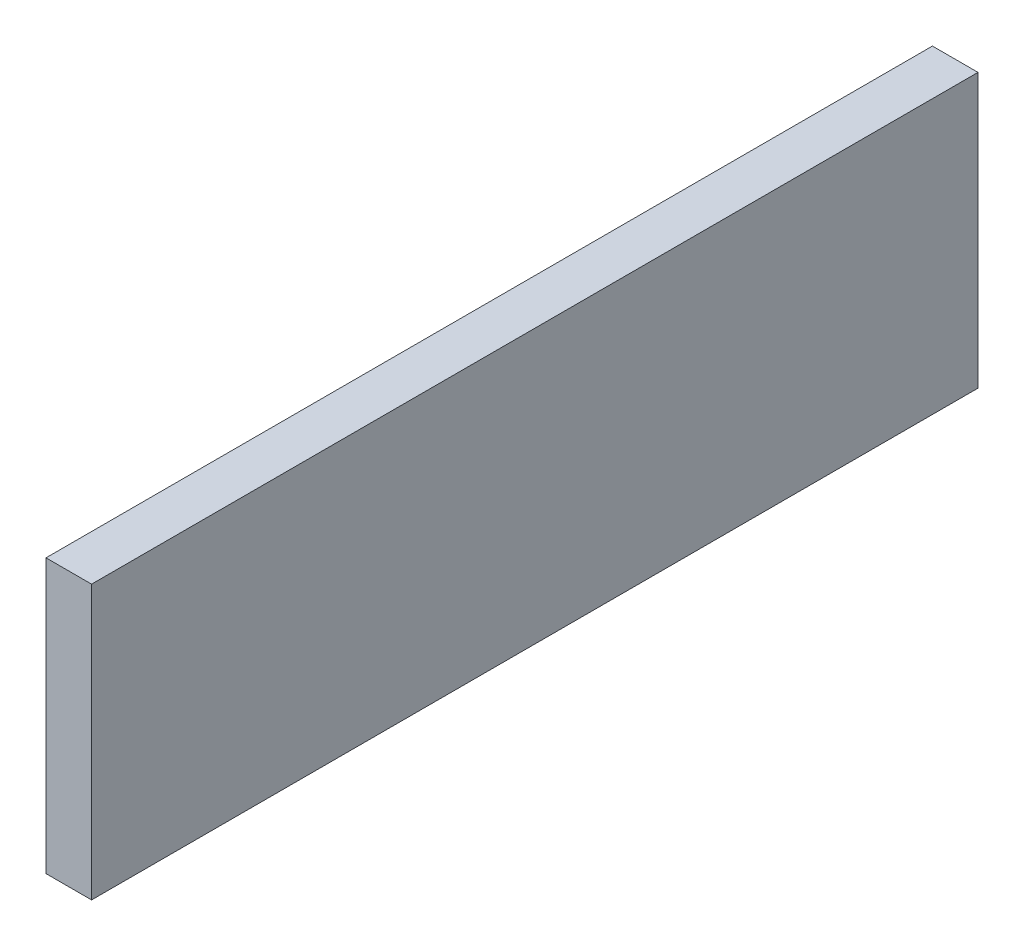
ISO-10303-21;
HEADER;
FILE_DESCRIPTION(('STEP AP214'),'2;1');
FILE_NAME('part.step','',(''),(''),'','','');
FILE_SCHEMA(('AUTOMOTIVE_DESIGN { 1 0 10303 214 1 1 1 1 }'));
ENDSEC;
DATA;
#1=APPLICATION_CONTEXT('core data for automotive mechanical design processes');
#2=APPLICATION_PROTOCOL_DEFINITION('international standard','automotive_design',2000,#1);
#3=PRODUCT_CONTEXT('',#1,'mechanical');
#4=PRODUCT('Part','Part','',(#3));
#5=PRODUCT_RELATED_PRODUCT_CATEGORY('part','',(#4));
#6=PRODUCT_DEFINITION_FORMATION('','',#4);
#7=PRODUCT_DEFINITION_CONTEXT('part definition',#1,'design');
#8=PRODUCT_DEFINITION('design','',#6,#7);
#9=PRODUCT_DEFINITION_SHAPE('','',#8);
#10=(LENGTH_UNIT() NAMED_UNIT(*) SI_UNIT(.MILLI.,.METRE.));
#11=(NAMED_UNIT(*) PLANE_ANGLE_UNIT() SI_UNIT($,.RADIAN.));
#12=(NAMED_UNIT(*) SI_UNIT($,.STERADIAN.) SOLID_ANGLE_UNIT());
#13=UNCERTAINTY_MEASURE_WITH_UNIT(LENGTH_MEASURE(1.E-05),#10,'distance_accuracy_value','');
#14=(GEOMETRIC_REPRESENTATION_CONTEXT(3) GLOBAL_UNCERTAINTY_ASSIGNED_CONTEXT((#13)) GLOBAL_UNIT_ASSIGNED_CONTEXT((#10,
#11,#12)) REPRESENTATION_CONTEXT('',''));
#15=CARTESIAN_POINT('',(0.,0.,0.));
#16=DIRECTION('',(0.,0.,1.));
#17=DIRECTION('',(1.,0.,0.));
#18=AXIS2_PLACEMENT_3D('',#15,#16,#17);
#19=CARTESIAN_POINT('',(14.14,0.,0.));
#20=DIRECTION('',(0.,0.,-1.));
#21=DIRECTION('',(-1.,0.,0.));
#22=AXIS2_PLACEMENT_3D('',#19,#20,#21);
#23=PLANE('',#22);
#24=DIRECTION('',(0.,-1.,0.));
#25=VECTOR('',#24,1.);
#26=CARTESIAN_POINT('',(0.,0.,0.));
#27=LINE('',#26,#25);
#28=CARTESIAN_POINT('',(0.,84.85,0.));
#29=VERTEX_POINT('',#28);
#30=CARTESIAN_POINT('',(0.,0.,0.));
#31=VERTEX_POINT('',#30);
#32=EDGE_CURVE('E102',#29,#31,#27,.T.);
#33=ORIENTED_EDGE('',*,*,#32,.T.);
#34=DIRECTION('',(-1.,0.,0.));
#35=VECTOR('',#34,1.);
#36=CARTESIAN_POINT('',(14.14,0.,0.));
#37=LINE('',#36,#35);
#38=CARTESIAN_POINT('',(14.14,0.,0.));
#39=VERTEX_POINT('',#38);
#40=EDGE_CURVE('E11',#39,#31,#37,.T.);
#41=ORIENTED_EDGE('',*,*,#40,.F.);
#42=DIRECTION('',(0.,-1.,0.));
#43=VECTOR('',#42,1.);
#44=CARTESIAN_POINT('',(14.14,0.,0.));
#45=LINE('',#44,#43);
#46=CARTESIAN_POINT('',(14.14,84.85,0.));
#47=VERTEX_POINT('',#46);
#48=EDGE_CURVE('E90',#47,#39,#45,.T.);
#49=ORIENTED_EDGE('',*,*,#48,.F.);
#50=DIRECTION('',(-1.,0.,0.));
#51=VECTOR('',#50,1.);
#52=CARTESIAN_POINT('',(14.14,84.85,0.));
#53=LINE('',#52,#51);
#54=EDGE_CURVE('E98',#47,#29,#53,.T.);
#55=ORIENTED_EDGE('',*,*,#54,.T.);
#56=EDGE_LOOP('',(#33,#41,#49,#55));
#57=FACE_BOUND('',#56,.T.);
#58=ADVANCED_FACE('F39',(#57),#23,.F.);
#59=CARTESIAN_POINT('',(14.14,0.,0.));
#60=DIRECTION('',(0.,1.,0.));
#61=DIRECTION('',(0.,0.,1.));
#62=AXIS2_PLACEMENT_3D('',#59,#60,#61);
#63=PLANE('',#62);
#64=DIRECTION('',(0.,0.,-1.));
#65=VECTOR('',#64,1.);
#66=CARTESIAN_POINT('',(0.,0.,0.));
#67=LINE('',#66,#65);
#68=CARTESIAN_POINT('',(0.,0.,-275.));
#69=VERTEX_POINT('',#68);
#70=EDGE_CURVE('E94',#31,#69,#67,.T.);
#71=ORIENTED_EDGE('',*,*,#70,.T.);
#72=DIRECTION('',(-1.,0.,0.));
#73=VECTOR('',#72,1.);
#74=CARTESIAN_POINT('',(14.14,0.,-275.));
#75=LINE('',#74,#73);
#76=CARTESIAN_POINT('',(14.14,0.,-275.));
#77=VERTEX_POINT('',#76);
#78=EDGE_CURVE('E47',#77,#69,#75,.T.);
#79=ORIENTED_EDGE('',*,*,#78,.F.);
#80=DIRECTION('',(0.,0.,-1.));
#81=VECTOR('',#80,1.);
#82=CARTESIAN_POINT('',(14.14,0.,0.));
#83=LINE('',#82,#81);
#84=EDGE_CURVE('E85',#39,#77,#83,.T.);
#85=ORIENTED_EDGE('',*,*,#84,.F.);
#86=ORIENTED_EDGE('',*,*,#40,.T.);
#87=EDGE_LOOP('',(#71,#79,#85,#86));
#88=FACE_BOUND('',#87,.T.);
#89=ADVANCED_FACE('F93',(#88),#63,.F.);
#90=CARTESIAN_POINT('',(14.14,0.,-275.));
#91=DIRECTION('',(0.,0.,1.));
#92=DIRECTION('',(1.,0.,0.));
#93=AXIS2_PLACEMENT_3D('',#90,#91,#92);
#94=PLANE('',#93);
#95=DIRECTION('',(0.,1.,0.));
#96=VECTOR('',#95,1.);
#97=CARTESIAN_POINT('',(0.,0.,-275.));
#98=LINE('',#97,#96);
#99=CARTESIAN_POINT('',(0.,84.85,-275.));
#100=VERTEX_POINT('',#99);
#101=EDGE_CURVE('E72',#69,#100,#98,.T.);
#102=ORIENTED_EDGE('',*,*,#101,.T.);
#103=DIRECTION('',(-1.,0.,0.));
#104=VECTOR('',#103,1.);
#105=CARTESIAN_POINT('',(14.14,84.85,-275.));
#106=LINE('',#105,#104);
#107=CARTESIAN_POINT('',(14.14,84.85,-275.));
#108=VERTEX_POINT('',#107);
#109=EDGE_CURVE('E95',#108,#100,#106,.T.);
#110=ORIENTED_EDGE('',*,*,#109,.F.);
#111=DIRECTION('',(0.,1.,0.));
#112=VECTOR('',#111,1.);
#113=CARTESIAN_POINT('',(14.14,0.,-275.));
#114=LINE('',#113,#112);
#115=EDGE_CURVE('E88',#77,#108,#114,.T.);
#116=ORIENTED_EDGE('',*,*,#115,.F.);
#117=ORIENTED_EDGE('',*,*,#78,.T.);
#118=EDGE_LOOP('',(#102,#110,#116,#117));
#119=FACE_BOUND('',#118,.T.);
#120=ADVANCED_FACE('F96',(#119),#94,.F.);
#121=CARTESIAN_POINT('',(14.14,84.85,0.));
#122=DIRECTION('',(0.,-1.,0.));
#123=DIRECTION('',(0.,0.,-1.));
#124=AXIS2_PLACEMENT_3D('',#121,#122,#123);
#125=PLANE('',#124);
#126=DIRECTION('',(0.,0.,1.));
#127=VECTOR('',#126,1.);
#128=CARTESIAN_POINT('',(0.,84.85,0.));
#129=LINE('',#128,#127);
#130=EDGE_CURVE('E78',#100,#29,#129,.T.);
#131=ORIENTED_EDGE('',*,*,#130,.T.);
#132=ORIENTED_EDGE('',*,*,#54,.F.);
#133=DIRECTION('',(0.,0.,1.));
#134=VECTOR('',#133,1.);
#135=CARTESIAN_POINT('',(14.14,84.85,0.));
#136=LINE('',#135,#134);
#137=EDGE_CURVE('E55',#108,#47,#136,.T.);
#138=ORIENTED_EDGE('',*,*,#137,.F.);
#139=ORIENTED_EDGE('',*,*,#109,.T.);
#140=EDGE_LOOP('',(#131,#132,#138,#139));
#141=FACE_BOUND('',#140,.T.);
#142=ADVANCED_FACE('F109',(#141),#125,.F.);
#143=CARTESIAN_POINT('',(14.14,0.,0.));
#144=DIRECTION('',(-1.,0.,0.));
#145=DIRECTION('',(0.,0.,1.));
#146=AXIS2_PLACEMENT_3D('',#143,#144,#145);
#147=PLANE('',#146);
#148=ORIENTED_EDGE('',*,*,#48,.T.);
#149=ORIENTED_EDGE('',*,*,#84,.T.);
#150=ORIENTED_EDGE('',*,*,#115,.T.);
#151=ORIENTED_EDGE('',*,*,#137,.T.);
#152=EDGE_LOOP('',(#148,#149,#150,#151));
#153=FACE_BOUND('',#152,.T.);
#154=ADVANCED_FACE('F86',(#153),#147,.F.);
#155=CARTESIAN_POINT('',(0.,0.,0.));
#156=DIRECTION('',(-1.,0.,0.));
#157=DIRECTION('',(0.,0.,1.));
#158=AXIS2_PLACEMENT_3D('',#155,#156,#157);
#159=PLANE('',#158);
#160=ORIENTED_EDGE('',*,*,#32,.F.);
#161=ORIENTED_EDGE('',*,*,#130,.F.);
#162=ORIENTED_EDGE('',*,*,#101,.F.);
#163=ORIENTED_EDGE('',*,*,#70,.F.);
#164=EDGE_LOOP('',(#160,#161,#162,#163));
#165=FACE_BOUND('',#164,.T.);
#166=ADVANCED_FACE('F112',(#165),#159,.T.);
#167=CLOSED_SHELL('',(#58,#89,#120,#142,#154,#166));
#168=MANIFOLD_SOLID_BREP('B2',#167);
#169=ADVANCED_BREP_SHAPE_REPRESENTATION('',(#18,#168),#14);
#170=SHAPE_DEFINITION_REPRESENTATION(#9,#169);
ENDSEC;
END-ISO-10303-21;
